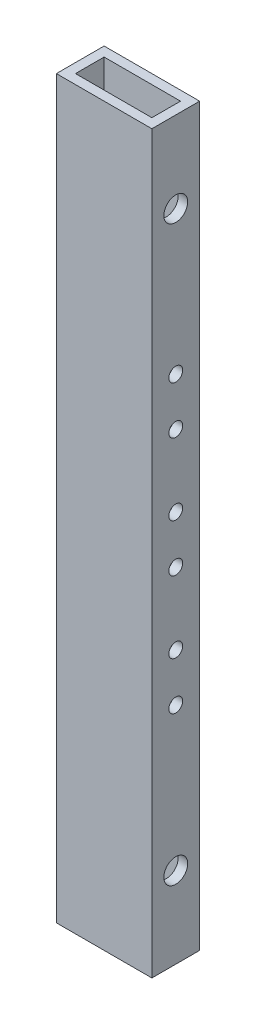
ISO-10303-21;
HEADER;
FILE_DESCRIPTION(('STEP AP214'),'2;1');
FILE_NAME('part.step','',(''),(''),'','','');
FILE_SCHEMA(('AUTOMOTIVE_DESIGN { 1 0 10303 214 1 1 1 1 }'));
ENDSEC;
DATA;
#1=APPLICATION_CONTEXT('core data for automotive mechanical design processes');
#2=APPLICATION_PROTOCOL_DEFINITION('international standard','automotive_design',2000,#1);
#3=PRODUCT_CONTEXT('',#1,'mechanical');
#4=PRODUCT('Part','Part','',(#3));
#5=PRODUCT_RELATED_PRODUCT_CATEGORY('part','',(#4));
#6=PRODUCT_DEFINITION_FORMATION('','',#4);
#7=PRODUCT_DEFINITION_CONTEXT('part definition',#1,'design');
#8=PRODUCT_DEFINITION('design','',#6,#7);
#9=PRODUCT_DEFINITION_SHAPE('','',#8);
#10=(LENGTH_UNIT() NAMED_UNIT(*) SI_UNIT(.MILLI.,.METRE.));
#11=(NAMED_UNIT(*) PLANE_ANGLE_UNIT() SI_UNIT($,.RADIAN.));
#12=(NAMED_UNIT(*) SI_UNIT($,.STERADIAN.) SOLID_ANGLE_UNIT());
#13=UNCERTAINTY_MEASURE_WITH_UNIT(LENGTH_MEASURE(1.E-05),#10,'distance_accuracy_value','');
#14=(GEOMETRIC_REPRESENTATION_CONTEXT(3) GLOBAL_UNCERTAINTY_ASSIGNED_CONTEXT((#13)) GLOBAL_UNIT_ASSIGNED_CONTEXT((#10,
#11,#12)) REPRESENTATION_CONTEXT('',''));
#15=CARTESIAN_POINT('',(0.,0.,0.));
#16=DIRECTION('',(0.,0.,1.));
#17=DIRECTION('',(1.,0.,0.));
#18=AXIS2_PLACEMENT_3D('',#15,#16,#17);
#19=CARTESIAN_POINT('',(0.,77.,0.));
#20=DIRECTION('',(0.,1.,0.));
#21=DIRECTION('',(0.,0.,1.));
#22=AXIS2_PLACEMENT_3D('',#19,#20,#21);
#23=PLANE('',#22);
#24=DIRECTION('',(0.,0.,-1.));
#25=VECTOR('',#24,1.);
#26=CARTESIAN_POINT('',(10.,77.,-5.));
#27=LINE('',#26,#25);
#28=CARTESIAN_POINT('',(10.,77.,5.));
#29=VERTEX_POINT('',#28);
#30=CARTESIAN_POINT('',(10.,77.,-5.));
#31=VERTEX_POINT('',#30);
#32=EDGE_CURVE('E157',#29,#31,#27,.T.);
#33=ORIENTED_EDGE('',*,*,#32,.T.);
#34=DIRECTION('',(-1.,0.,0.));
#35=VECTOR('',#34,1.);
#36=CARTESIAN_POINT('',(-10.,77.,-5.));
#37=LINE('',#36,#35);
#38=CARTESIAN_POINT('',(-10.,77.,-5.));
#39=VERTEX_POINT('',#38);
#40=EDGE_CURVE('E161',#31,#39,#37,.T.);
#41=ORIENTED_EDGE('',*,*,#40,.T.);
#42=DIRECTION('',(0.,0.,1.));
#43=VECTOR('',#42,1.);
#44=CARTESIAN_POINT('',(-10.,77.,-5.));
#45=LINE('',#44,#43);
#46=CARTESIAN_POINT('',(-10.,77.,5.));
#47=VERTEX_POINT('',#46);
#48=EDGE_CURVE('E165',#39,#47,#45,.T.);
#49=ORIENTED_EDGE('',*,*,#48,.T.);
#50=DIRECTION('',(1.,0.,0.));
#51=VECTOR('',#50,1.);
#52=CARTESIAN_POINT('',(-10.,77.,5.));
#53=LINE('',#52,#51);
#54=EDGE_CURVE('E168',#47,#29,#53,.T.);
#55=ORIENTED_EDGE('',*,*,#54,.T.);
#56=EDGE_LOOP('',(#33,#41,#49,#55));
#57=FACE_BOUND('',#56,.T.);
#58=DIRECTION('',(-1.,0.,0.));
#59=VECTOR('',#58,1.);
#60=CARTESIAN_POINT('',(-8.,77.,-3.));
#61=LINE('',#60,#59);
#62=CARTESIAN_POINT('',(8.,77.,-3.));
#63=VERTEX_POINT('',#62);
#64=CARTESIAN_POINT('',(-8.,77.,-3.));
#65=VERTEX_POINT('',#64);
#66=EDGE_CURVE('E116',#63,#65,#61,.T.);
#67=ORIENTED_EDGE('',*,*,#66,.F.);
#68=DIRECTION('',(0.,0.,-1.));
#69=VECTOR('',#68,1.);
#70=CARTESIAN_POINT('',(8.,77.,-3.));
#71=LINE('',#70,#69);
#72=CARTESIAN_POINT('',(8.,77.,3.));
#73=VERTEX_POINT('',#72);
#74=EDGE_CURVE('E107',#73,#63,#71,.T.);
#75=ORIENTED_EDGE('',*,*,#74,.F.);
#76=DIRECTION('',(1.,0.,0.));
#77=VECTOR('',#76,1.);
#78=CARTESIAN_POINT('',(-8.,77.,3.));
#79=LINE('',#78,#77);
#80=CARTESIAN_POINT('',(-8.,77.,3.));
#81=VERTEX_POINT('',#80);
#82=EDGE_CURVE('E133',#81,#73,#79,.T.);
#83=ORIENTED_EDGE('',*,*,#82,.F.);
#84=DIRECTION('',(0.,0.,1.));
#85=VECTOR('',#84,1.);
#86=CARTESIAN_POINT('',(-8.,77.,-3.));
#87=LINE('',#86,#85);
#88=EDGE_CURVE('E129',#65,#81,#87,.T.);
#89=ORIENTED_EDGE('',*,*,#88,.F.);
#90=EDGE_LOOP('',(#67,#75,#83,#89));
#91=FACE_BOUND('',#90,.T.);
#92=ADVANCED_FACE('F39',(#57,#91),#23,.T.);
#93=CARTESIAN_POINT('',(0.,-77.,0.));
#94=DIRECTION('',(0.,1.,0.));
#95=DIRECTION('',(0.,0.,1.));
#96=AXIS2_PLACEMENT_3D('',#93,#94,#95);
#97=PLANE('',#96);
#98=DIRECTION('',(0.,0.,-1.));
#99=VECTOR('',#98,1.);
#100=CARTESIAN_POINT('',(10.,-77.,-5.));
#101=LINE('',#100,#99);
#102=CARTESIAN_POINT('',(10.,-77.,5.));
#103=VERTEX_POINT('',#102);
#104=CARTESIAN_POINT('',(10.,-77.,-5.));
#105=VERTEX_POINT('',#104);
#106=EDGE_CURVE('E125',#103,#105,#101,.T.);
#107=ORIENTED_EDGE('',*,*,#106,.F.);
#108=DIRECTION('',(1.,0.,0.));
#109=VECTOR('',#108,1.);
#110=CARTESIAN_POINT('',(-10.,-77.,5.));
#111=LINE('',#110,#109);
#112=CARTESIAN_POINT('',(-10.,-77.,5.));
#113=VERTEX_POINT('',#112);
#114=EDGE_CURVE('E162',#113,#103,#111,.T.);
#115=ORIENTED_EDGE('',*,*,#114,.F.);
#116=DIRECTION('',(0.,0.,1.));
#117=VECTOR('',#116,1.);
#118=CARTESIAN_POINT('',(-10.,-77.,-5.));
#119=LINE('',#118,#117);
#120=CARTESIAN_POINT('',(-10.,-77.,-5.));
#121=VERTEX_POINT('',#120);
#122=EDGE_CURVE('E178',#121,#113,#119,.T.);
#123=ORIENTED_EDGE('',*,*,#122,.F.);
#124=DIRECTION('',(-1.,0.,0.));
#125=VECTOR('',#124,1.);
#126=CARTESIAN_POINT('',(-10.,-77.,-5.));
#127=LINE('',#126,#125);
#128=EDGE_CURVE('E175',#105,#121,#127,.T.);
#129=ORIENTED_EDGE('',*,*,#128,.F.);
#130=EDGE_LOOP('',(#107,#115,#123,#129));
#131=FACE_BOUND('',#130,.T.);
#132=DIRECTION('',(0.,0.,-1.));
#133=VECTOR('',#132,1.);
#134=CARTESIAN_POINT('',(8.,-77.,-3.));
#135=LINE('',#134,#133);
#136=CARTESIAN_POINT('',(8.,-77.,3.));
#137=VERTEX_POINT('',#136);
#138=CARTESIAN_POINT('',(8.,-77.,-3.));
#139=VERTEX_POINT('',#138);
#140=EDGE_CURVE('E65',#137,#139,#135,.T.);
#141=ORIENTED_EDGE('',*,*,#140,.T.);
#142=DIRECTION('',(-1.,0.,0.));
#143=VECTOR('',#142,1.);
#144=CARTESIAN_POINT('',(-8.,-77.,-3.));
#145=LINE('',#144,#143);
#146=CARTESIAN_POINT('',(-8.,-77.,-3.));
#147=VERTEX_POINT('',#146);
#148=EDGE_CURVE('E123',#139,#147,#145,.T.);
#149=ORIENTED_EDGE('',*,*,#148,.T.);
#150=DIRECTION('',(0.,0.,1.));
#151=VECTOR('',#150,1.);
#152=CARTESIAN_POINT('',(-8.,-77.,-3.));
#153=LINE('',#152,#151);
#154=CARTESIAN_POINT('',(-8.,-77.,3.));
#155=VERTEX_POINT('',#154);
#156=EDGE_CURVE('E144',#147,#155,#153,.T.);
#157=ORIENTED_EDGE('',*,*,#156,.T.);
#158=DIRECTION('',(1.,0.,0.));
#159=VECTOR('',#158,1.);
#160=CARTESIAN_POINT('',(-8.,-77.,3.));
#161=LINE('',#160,#159);
#162=EDGE_CURVE('E117',#155,#137,#161,.T.);
#163=ORIENTED_EDGE('',*,*,#162,.T.);
#164=EDGE_LOOP('',(#141,#149,#157,#163));
#165=FACE_BOUND('',#164,.T.);
#166=ADVANCED_FACE('F270',(#131,#165),#97,.F.);
#167=CARTESIAN_POINT('',(10.,77.,-5.));
#168=DIRECTION('',(-1.,0.,0.));
#169=DIRECTION('',(0.,0.,1.));
#170=AXIS2_PLACEMENT_3D('',#167,#168,#169);
#171=PLANE('',#170);
#172=CARTESIAN_POINT('',(10.,20.,0.));
#173=DIRECTION('',(1.,0.,0.));
#174=DIRECTION('',(0.,0.,-1.));
#175=AXIS2_PLACEMENT_3D('',#172,#173,#174);
#176=CIRCLE('',#175,1.45);
#177=CARTESIAN_POINT('',(10.,20.,-1.45));
#178=VERTEX_POINT('',#177);
#179=EDGE_CURVE('E323',#178,#178,#176,.T.);
#180=ORIENTED_EDGE('',*,*,#179,.F.);
#181=EDGE_LOOP('',(#180));
#182=FACE_BOUND('',#181,.T.);
#183=CARTESIAN_POINT('',(10.,30.,0.));
#184=DIRECTION('',(1.,0.,0.));
#185=DIRECTION('',(0.,0.,-1.));
#186=AXIS2_PLACEMENT_3D('',#183,#184,#185);
#187=CIRCLE('',#186,1.45);
#188=CARTESIAN_POINT('',(10.,30.,-1.45));
#189=VERTEX_POINT('',#188);
#190=EDGE_CURVE('E327',#189,#189,#187,.T.);
#191=ORIENTED_EDGE('',*,*,#190,.F.);
#192=EDGE_LOOP('',(#191));
#193=FACE_BOUND('',#192,.T.);
#194=CARTESIAN_POINT('',(10.,-30.,0.));
#195=DIRECTION('',(1.,0.,0.));
#196=DIRECTION('',(0.,0.,1.));
#197=AXIS2_PLACEMENT_3D('',#194,#195,#196);
#198=CIRCLE('',#197,1.45);
#199=CARTESIAN_POINT('',(10.,-30.,1.45));
#200=VERTEX_POINT('',#199);
#201=EDGE_CURVE('E331',#200,#200,#198,.T.);
#202=ORIENTED_EDGE('',*,*,#201,.F.);
#203=EDGE_LOOP('',(#202));
#204=FACE_BOUND('',#203,.T.);
#205=CARTESIAN_POINT('',(10.,-20.,0.));
#206=DIRECTION('',(1.,0.,0.));
#207=DIRECTION('',(0.,0.,1.));
#208=AXIS2_PLACEMENT_3D('',#205,#206,#207);
#209=CIRCLE('',#208,1.45);
#210=CARTESIAN_POINT('',(10.,-20.,1.45));
#211=VERTEX_POINT('',#210);
#212=EDGE_CURVE('E335',#211,#211,#209,.T.);
#213=ORIENTED_EDGE('',*,*,#212,.F.);
#214=EDGE_LOOP('',(#213));
#215=FACE_BOUND('',#214,.T.);
#216=CARTESIAN_POINT('',(10.,-5.,0.));
#217=DIRECTION('',(1.,0.,0.));
#218=DIRECTION('',(0.,0.,1.));
#219=AXIS2_PLACEMENT_3D('',#216,#217,#218);
#220=CIRCLE('',#219,1.45);
#221=CARTESIAN_POINT('',(10.,-5.,1.45));
#222=VERTEX_POINT('',#221);
#223=EDGE_CURVE('E339',#222,#222,#220,.T.);
#224=ORIENTED_EDGE('',*,*,#223,.F.);
#225=EDGE_LOOP('',(#224));
#226=FACE_BOUND('',#225,.T.);
#227=CARTESIAN_POINT('',(10.,60.,0.));
#228=DIRECTION('',(1.,0.,0.));
#229=DIRECTION('',(0.,0.,-1.));
#230=AXIS2_PLACEMENT_3D('',#227,#228,#229);
#231=CIRCLE('',#230,2.5);
#232=CARTESIAN_POINT('',(10.,60.,-2.49999999999999));
#233=VERTEX_POINT('',#232);
#234=EDGE_CURVE('E343',#233,#233,#231,.T.);
#235=ORIENTED_EDGE('',*,*,#234,.F.);
#236=EDGE_LOOP('',(#235));
#237=FACE_BOUND('',#236,.T.);
#238=CARTESIAN_POINT('',(10.,-60.,0.));
#239=DIRECTION('',(1.,0.,0.));
#240=DIRECTION('',(0.,0.,1.));
#241=AXIS2_PLACEMENT_3D('',#238,#239,#240);
#242=CIRCLE('',#241,2.5);
#243=CARTESIAN_POINT('',(10.,-60.,2.5));
#244=VERTEX_POINT('',#243);
#245=EDGE_CURVE('E347',#244,#244,#242,.T.);
#246=ORIENTED_EDGE('',*,*,#245,.F.);
#247=EDGE_LOOP('',(#246));
#248=FACE_BOUND('',#247,.T.);
#249=CARTESIAN_POINT('',(10.,5.,0.));
#250=DIRECTION('',(1.,0.,0.));
#251=DIRECTION('',(0.,0.,-1.));
#252=AXIS2_PLACEMENT_3D('',#249,#250,#251);
#253=CIRCLE('',#252,1.45);
#254=CARTESIAN_POINT('',(10.,5.,-1.45));
#255=VERTEX_POINT('',#254);
#256=EDGE_CURVE('E350',#255,#255,#253,.T.);
#257=ORIENTED_EDGE('',*,*,#256,.F.);
#258=EDGE_LOOP('',(#257));
#259=FACE_BOUND('',#258,.T.);
#260=ORIENTED_EDGE('',*,*,#106,.T.);
#261=DIRECTION('',(0.,-1.,0.));
#262=VECTOR('',#261,1.);
#263=CARTESIAN_POINT('',(10.,77.,-5.));
#264=LINE('',#263,#262);
#265=EDGE_CURVE('E11',#31,#105,#264,.T.);
#266=ORIENTED_EDGE('',*,*,#265,.F.);
#267=ORIENTED_EDGE('',*,*,#32,.F.);
#268=DIRECTION('',(0.,-1.,0.));
#269=VECTOR('',#268,1.);
#270=CARTESIAN_POINT('',(10.,77.,5.));
#271=LINE('',#270,#269);
#272=EDGE_CURVE('E171',#29,#103,#271,.T.);
#273=ORIENTED_EDGE('',*,*,#272,.T.);
#274=EDGE_LOOP('',(#260,#266,#267,#273));
#275=FACE_BOUND('',#274,.T.);
#276=ADVANCED_FACE('F41',(#182,#193,#204,#215,#226,#237,#248,#259,#275),#171,.F.);
#277=CARTESIAN_POINT('',(-10.,77.,-5.));
#278=DIRECTION('',(0.,0.,1.));
#279=DIRECTION('',(1.,0.,0.));
#280=AXIS2_PLACEMENT_3D('',#277,#278,#279);
#281=PLANE('',#280);
#282=ORIENTED_EDGE('',*,*,#128,.T.);
#283=DIRECTION('',(0.,-1.,0.));
#284=VECTOR('',#283,1.);
#285=CARTESIAN_POINT('',(-10.,77.,-5.));
#286=LINE('',#285,#284);
#287=EDGE_CURVE('E49',#39,#121,#286,.T.);
#288=ORIENTED_EDGE('',*,*,#287,.F.);
#289=ORIENTED_EDGE('',*,*,#40,.F.);
#290=ORIENTED_EDGE('',*,*,#265,.T.);
#291=EDGE_LOOP('',(#282,#288,#289,#290));
#292=FACE_BOUND('',#291,.T.);
#293=ADVANCED_FACE('F298',(#292),#281,.F.);
#294=CARTESIAN_POINT('',(-10.,77.,-5.));
#295=DIRECTION('',(1.,0.,0.));
#296=DIRECTION('',(0.,0.,-1.));
#297=AXIS2_PLACEMENT_3D('',#294,#295,#296);
#298=PLANE('',#297);
#299=CARTESIAN_POINT('',(-10.,20.,0.));
#300=DIRECTION('',(1.,0.,0.));
#301=DIRECTION('',(0.,0.,-1.));
#302=AXIS2_PLACEMENT_3D('',#299,#300,#301);
#303=CIRCLE('',#302,1.45);
#304=CARTESIAN_POINT('',(-10.,20.,-1.45));
#305=VERTEX_POINT('',#304);
#306=EDGE_CURVE('E353',#305,#305,#303,.T.);
#307=ORIENTED_EDGE('',*,*,#306,.T.);
#308=EDGE_LOOP('',(#307));
#309=FACE_BOUND('',#308,.T.);
#310=CARTESIAN_POINT('',(-10.,30.,0.));
#311=DIRECTION('',(1.,0.,0.));
#312=DIRECTION('',(0.,0.,-1.));
#313=AXIS2_PLACEMENT_3D('',#310,#311,#312);
#314=CIRCLE('',#313,1.45);
#315=CARTESIAN_POINT('',(-10.,30.,-1.45));
#316=VERTEX_POINT('',#315);
#317=EDGE_CURVE('E451',#316,#316,#314,.T.);
#318=ORIENTED_EDGE('',*,*,#317,.T.);
#319=EDGE_LOOP('',(#318));
#320=FACE_BOUND('',#319,.T.);
#321=CARTESIAN_POINT('',(-10.,-30.,0.));
#322=DIRECTION('',(1.,0.,0.));
#323=DIRECTION('',(0.,0.,1.));
#324=AXIS2_PLACEMENT_3D('',#321,#322,#323);
#325=CIRCLE('',#324,1.45);
#326=CARTESIAN_POINT('',(-10.,-30.,1.45));
#327=VERTEX_POINT('',#326);
#328=EDGE_CURVE('E457',#327,#327,#325,.T.);
#329=ORIENTED_EDGE('',*,*,#328,.T.);
#330=EDGE_LOOP('',(#329));
#331=FACE_BOUND('',#330,.T.);
#332=CARTESIAN_POINT('',(-10.,-20.,0.));
#333=DIRECTION('',(1.,0.,0.));
#334=DIRECTION('',(0.,0.,1.));
#335=AXIS2_PLACEMENT_3D('',#332,#333,#334);
#336=CIRCLE('',#335,1.45);
#337=CARTESIAN_POINT('',(-10.,-20.,1.45));
#338=VERTEX_POINT('',#337);
#339=EDGE_CURVE('E463',#338,#338,#336,.T.);
#340=ORIENTED_EDGE('',*,*,#339,.T.);
#341=EDGE_LOOP('',(#340));
#342=FACE_BOUND('',#341,.T.);
#343=CARTESIAN_POINT('',(-10.,-5.,0.));
#344=DIRECTION('',(1.,0.,0.));
#345=DIRECTION('',(0.,0.,1.));
#346=AXIS2_PLACEMENT_3D('',#343,#344,#345);
#347=CIRCLE('',#346,1.45);
#348=CARTESIAN_POINT('',(-10.,-5.,1.45));
#349=VERTEX_POINT('',#348);
#350=EDGE_CURVE('E467',#349,#349,#347,.T.);
#351=ORIENTED_EDGE('',*,*,#350,.T.);
#352=EDGE_LOOP('',(#351));
#353=FACE_BOUND('',#352,.T.);
#354=CARTESIAN_POINT('',(-10.,60.,0.));
#355=DIRECTION('',(1.,0.,0.));
#356=DIRECTION('',(0.,0.,-1.));
#357=AXIS2_PLACEMENT_3D('',#354,#355,#356);
#358=CIRCLE('',#357,2.5);
#359=CARTESIAN_POINT('',(-10.,60.,-2.49999999999999));
#360=VERTEX_POINT('',#359);
#361=EDGE_CURVE('E436',#360,#360,#358,.T.);
#362=ORIENTED_EDGE('',*,*,#361,.T.);
#363=EDGE_LOOP('',(#362));
#364=FACE_BOUND('',#363,.T.);
#365=CARTESIAN_POINT('',(-10.,-60.,0.));
#366=DIRECTION('',(1.,0.,0.));
#367=DIRECTION('',(0.,0.,1.));
#368=AXIS2_PLACEMENT_3D('',#365,#366,#367);
#369=CIRCLE('',#368,2.5);
#370=CARTESIAN_POINT('',(-10.,-60.,2.5));
#371=VERTEX_POINT('',#370);
#372=EDGE_CURVE('E437',#371,#371,#369,.T.);
#373=ORIENTED_EDGE('',*,*,#372,.T.);
#374=EDGE_LOOP('',(#373));
#375=FACE_BOUND('',#374,.T.);
#376=CARTESIAN_POINT('',(-10.,5.,0.));
#377=DIRECTION('',(1.,0.,0.));
#378=DIRECTION('',(0.,0.,-1.));
#379=AXIS2_PLACEMENT_3D('',#376,#377,#378);
#380=CIRCLE('',#379,1.45);
#381=CARTESIAN_POINT('',(-10.,5.,-1.45));
#382=VERTEX_POINT('',#381);
#383=EDGE_CURVE('E198',#382,#382,#380,.T.);
#384=ORIENTED_EDGE('',*,*,#383,.T.);
#385=EDGE_LOOP('',(#384));
#386=FACE_BOUND('',#385,.T.);
#387=ORIENTED_EDGE('',*,*,#122,.T.);
#388=DIRECTION('',(0.,-1.,0.));
#389=VECTOR('',#388,1.);
#390=CARTESIAN_POINT('',(-10.,77.,5.));
#391=LINE('',#390,#389);
#392=EDGE_CURVE('E186',#47,#113,#391,.T.);
#393=ORIENTED_EDGE('',*,*,#392,.F.);
#394=ORIENTED_EDGE('',*,*,#48,.F.);
#395=ORIENTED_EDGE('',*,*,#287,.T.);
#396=EDGE_LOOP('',(#387,#393,#394,#395));
#397=FACE_BOUND('',#396,.T.);
#398=ADVANCED_FACE('F295',(#309,#320,#331,#342,#353,#364,#375,#386,#397),#298,.F.);
#399=CARTESIAN_POINT('',(-10.,77.,5.));
#400=DIRECTION('',(0.,0.,-1.));
#401=DIRECTION('',(-1.,0.,0.));
#402=AXIS2_PLACEMENT_3D('',#399,#400,#401);
#403=PLANE('',#402);
#404=ORIENTED_EDGE('',*,*,#114,.T.);
#405=ORIENTED_EDGE('',*,*,#272,.F.);
#406=ORIENTED_EDGE('',*,*,#54,.F.);
#407=ORIENTED_EDGE('',*,*,#392,.T.);
#408=EDGE_LOOP('',(#404,#405,#406,#407));
#409=FACE_BOUND('',#408,.T.);
#410=ADVANCED_FACE('F292',(#409),#403,.F.);
#411=CARTESIAN_POINT('',(8.,77.,-3.));
#412=DIRECTION('',(-1.,0.,0.));
#413=DIRECTION('',(0.,0.,1.));
#414=AXIS2_PLACEMENT_3D('',#411,#412,#413);
#415=PLANE('',#414);
#416=CARTESIAN_POINT('',(8.,20.,0.));
#417=DIRECTION('',(-1.,0.,0.));
#418=DIRECTION('',(0.,0.,1.));
#419=AXIS2_PLACEMENT_3D('',#416,#417,#418);
#420=CIRCLE('',#419,1.45);
#421=CARTESIAN_POINT('',(8.,20.,1.45));
#422=VERTEX_POINT('',#421);
#423=EDGE_CURVE('E141',#422,#422,#420,.T.);
#424=ORIENTED_EDGE('',*,*,#423,.F.);
#425=EDGE_LOOP('',(#424));
#426=FACE_BOUND('',#425,.T.);
#427=CARTESIAN_POINT('',(8.,30.,0.));
#428=DIRECTION('',(-1.,0.,0.));
#429=DIRECTION('',(0.,0.,1.));
#430=AXIS2_PLACEMENT_3D('',#427,#428,#429);
#431=CIRCLE('',#430,1.45);
#432=CARTESIAN_POINT('',(8.,30.,1.45));
#433=VERTEX_POINT('',#432);
#434=EDGE_CURVE('E226',#433,#433,#431,.T.);
#435=ORIENTED_EDGE('',*,*,#434,.F.);
#436=EDGE_LOOP('',(#435));
#437=FACE_BOUND('',#436,.T.);
#438=CARTESIAN_POINT('',(8.,-30.,0.));
#439=DIRECTION('',(-1.,0.,0.));
#440=DIRECTION('',(0.,0.,1.));
#441=AXIS2_PLACEMENT_3D('',#438,#439,#440);
#442=CIRCLE('',#441,1.45);
#443=CARTESIAN_POINT('',(8.,-30.,1.45));
#444=VERTEX_POINT('',#443);
#445=EDGE_CURVE('E222',#444,#444,#442,.T.);
#446=ORIENTED_EDGE('',*,*,#445,.F.);
#447=EDGE_LOOP('',(#446));
#448=FACE_BOUND('',#447,.T.);
#449=CARTESIAN_POINT('',(8.,-20.,0.));
#450=DIRECTION('',(-1.,0.,0.));
#451=DIRECTION('',(0.,0.,1.));
#452=AXIS2_PLACEMENT_3D('',#449,#450,#451);
#453=CIRCLE('',#452,1.45);
#454=CARTESIAN_POINT('',(8.,-20.,1.45));
#455=VERTEX_POINT('',#454);
#456=EDGE_CURVE('E218',#455,#455,#453,.T.);
#457=ORIENTED_EDGE('',*,*,#456,.F.);
#458=EDGE_LOOP('',(#457));
#459=FACE_BOUND('',#458,.T.);
#460=CARTESIAN_POINT('',(8.,-5.,0.));
#461=DIRECTION('',(-1.,0.,0.));
#462=DIRECTION('',(0.,0.,1.));
#463=AXIS2_PLACEMENT_3D('',#460,#461,#462);
#464=CIRCLE('',#463,1.45);
#465=CARTESIAN_POINT('',(8.,-5.,1.45));
#466=VERTEX_POINT('',#465);
#467=EDGE_CURVE('E213',#466,#466,#464,.T.);
#468=ORIENTED_EDGE('',*,*,#467,.F.);
#469=EDGE_LOOP('',(#468));
#470=FACE_BOUND('',#469,.T.);
#471=CARTESIAN_POINT('',(8.,60.,0.));
#472=DIRECTION('',(-1.,0.,0.));
#473=DIRECTION('',(0.,0.,1.));
#474=AXIS2_PLACEMENT_3D('',#471,#472,#473);
#475=CIRCLE('',#474,2.5);
#476=CARTESIAN_POINT('',(8.,60.,2.50000000000001));
#477=VERTEX_POINT('',#476);
#478=EDGE_CURVE('E208',#477,#477,#475,.T.);
#479=ORIENTED_EDGE('',*,*,#478,.F.);
#480=EDGE_LOOP('',(#479));
#481=FACE_BOUND('',#480,.T.);
#482=CARTESIAN_POINT('',(8.,-60.,0.));
#483=DIRECTION('',(-1.,0.,0.));
#484=DIRECTION('',(0.,0.,1.));
#485=AXIS2_PLACEMENT_3D('',#482,#483,#484);
#486=CIRCLE('',#485,2.5);
#487=CARTESIAN_POINT('',(8.,-60.,2.5));
#488=VERTEX_POINT('',#487);
#489=EDGE_CURVE('E203',#488,#488,#486,.T.);
#490=ORIENTED_EDGE('',*,*,#489,.F.);
#491=EDGE_LOOP('',(#490));
#492=FACE_BOUND('',#491,.T.);
#493=CARTESIAN_POINT('',(8.,5.,0.));
#494=DIRECTION('',(-1.,0.,0.));
#495=DIRECTION('',(0.,0.,1.));
#496=AXIS2_PLACEMENT_3D('',#493,#494,#495);
#497=CIRCLE('',#496,1.45);
#498=CARTESIAN_POINT('',(8.,5.,1.45));
#499=VERTEX_POINT('',#498);
#500=EDGE_CURVE('E197',#499,#499,#497,.T.);
#501=ORIENTED_EDGE('',*,*,#500,.F.);
#502=EDGE_LOOP('',(#501));
#503=FACE_BOUND('',#502,.T.);
#504=ORIENTED_EDGE('',*,*,#140,.F.);
#505=DIRECTION('',(0.,-1.,0.));
#506=VECTOR('',#505,1.);
#507=CARTESIAN_POINT('',(8.,77.,3.));
#508=LINE('',#507,#506);
#509=EDGE_CURVE('E111',#73,#137,#508,.T.);
#510=ORIENTED_EDGE('',*,*,#509,.F.);
#511=ORIENTED_EDGE('',*,*,#74,.T.);
#512=DIRECTION('',(0.,-1.,0.));
#513=VECTOR('',#512,1.);
#514=CARTESIAN_POINT('',(8.,77.,-3.));
#515=LINE('',#514,#513);
#516=EDGE_CURVE('E110',#63,#139,#515,.T.);
#517=ORIENTED_EDGE('',*,*,#516,.T.);
#518=EDGE_LOOP('',(#504,#510,#511,#517));
#519=FACE_BOUND('',#518,.T.);
#520=ADVANCED_FACE('F109',(#426,#437,#448,#459,#470,#481,#492,#503,#519),#415,.T.);
#521=CARTESIAN_POINT('',(-8.,77.,-3.));
#522=DIRECTION('',(0.,0.,1.));
#523=DIRECTION('',(1.,0.,0.));
#524=AXIS2_PLACEMENT_3D('',#521,#522,#523);
#525=PLANE('',#524);
#526=ORIENTED_EDGE('',*,*,#148,.F.);
#527=ORIENTED_EDGE('',*,*,#516,.F.);
#528=ORIENTED_EDGE('',*,*,#66,.T.);
#529=DIRECTION('',(0.,-1.,0.));
#530=VECTOR('',#529,1.);
#531=CARTESIAN_POINT('',(-8.,77.,-3.));
#532=LINE('',#531,#530);
#533=EDGE_CURVE('E126',#65,#147,#532,.T.);
#534=ORIENTED_EDGE('',*,*,#533,.T.);
#535=EDGE_LOOP('',(#526,#527,#528,#534));
#536=FACE_BOUND('',#535,.T.);
#537=ADVANCED_FACE('F120',(#536),#525,.T.);
#538=CARTESIAN_POINT('',(-8.,77.,-3.));
#539=DIRECTION('',(1.,0.,0.));
#540=DIRECTION('',(0.,0.,-1.));
#541=AXIS2_PLACEMENT_3D('',#538,#539,#540);
#542=PLANE('',#541);
#543=CARTESIAN_POINT('',(-8.,20.,0.));
#544=DIRECTION('',(1.,0.,0.));
#545=DIRECTION('',(0.,0.,-1.));
#546=AXIS2_PLACEMENT_3D('',#543,#544,#545);
#547=CIRCLE('',#546,1.45);
#548=CARTESIAN_POINT('',(-8.,20.,-1.45));
#549=VERTEX_POINT('',#548);
#550=EDGE_CURVE('E43',#549,#549,#547,.T.);
#551=ORIENTED_EDGE('',*,*,#550,.F.);
#552=EDGE_LOOP('',(#551));
#553=FACE_BOUND('',#552,.T.);
#554=CARTESIAN_POINT('',(-8.,30.,0.));
#555=DIRECTION('',(1.,0.,0.));
#556=DIRECTION('',(0.,0.,-1.));
#557=AXIS2_PLACEMENT_3D('',#554,#555,#556);
#558=CIRCLE('',#557,1.45);
#559=CARTESIAN_POINT('',(-8.,30.,-1.45));
#560=VERTEX_POINT('',#559);
#561=EDGE_CURVE('E223',#560,#560,#558,.T.);
#562=ORIENTED_EDGE('',*,*,#561,.F.);
#563=EDGE_LOOP('',(#562));
#564=FACE_BOUND('',#563,.T.);
#565=CARTESIAN_POINT('',(-8.,-30.,0.));
#566=DIRECTION('',(1.,0.,0.));
#567=DIRECTION('',(0.,0.,-1.));
#568=AXIS2_PLACEMENT_3D('',#565,#566,#567);
#569=CIRCLE('',#568,1.45);
#570=CARTESIAN_POINT('',(-8.,-30.,-1.45));
#571=VERTEX_POINT('',#570);
#572=EDGE_CURVE('E219',#571,#571,#569,.T.);
#573=ORIENTED_EDGE('',*,*,#572,.F.);
#574=EDGE_LOOP('',(#573));
#575=FACE_BOUND('',#574,.T.);
#576=CARTESIAN_POINT('',(-8.,-20.,0.));
#577=DIRECTION('',(1.,0.,0.));
#578=DIRECTION('',(0.,0.,-1.));
#579=AXIS2_PLACEMENT_3D('',#576,#577,#578);
#580=CIRCLE('',#579,1.45);
#581=CARTESIAN_POINT('',(-8.,-20.,-1.45));
#582=VERTEX_POINT('',#581);
#583=EDGE_CURVE('E214',#582,#582,#580,.T.);
#584=ORIENTED_EDGE('',*,*,#583,.F.);
#585=EDGE_LOOP('',(#584));
#586=FACE_BOUND('',#585,.T.);
#587=CARTESIAN_POINT('',(-8.,-5.,0.));
#588=DIRECTION('',(1.,0.,0.));
#589=DIRECTION('',(0.,0.,-1.));
#590=AXIS2_PLACEMENT_3D('',#587,#588,#589);
#591=CIRCLE('',#590,1.45);
#592=CARTESIAN_POINT('',(-8.,-5.,-1.45));
#593=VERTEX_POINT('',#592);
#594=EDGE_CURVE('E209',#593,#593,#591,.T.);
#595=ORIENTED_EDGE('',*,*,#594,.F.);
#596=EDGE_LOOP('',(#595));
#597=FACE_BOUND('',#596,.T.);
#598=CARTESIAN_POINT('',(-8.,60.,0.));
#599=DIRECTION('',(1.,0.,0.));
#600=DIRECTION('',(0.,0.,-1.));
#601=AXIS2_PLACEMENT_3D('',#598,#599,#600);
#602=CIRCLE('',#601,2.5);
#603=CARTESIAN_POINT('',(-8.,60.,-2.49999999999999));
#604=VERTEX_POINT('',#603);
#605=EDGE_CURVE('E204',#604,#604,#602,.T.);
#606=ORIENTED_EDGE('',*,*,#605,.F.);
#607=EDGE_LOOP('',(#606));
#608=FACE_BOUND('',#607,.T.);
#609=CARTESIAN_POINT('',(-8.,-60.,0.));
#610=DIRECTION('',(1.,0.,0.));
#611=DIRECTION('',(0.,0.,-1.));
#612=AXIS2_PLACEMENT_3D('',#609,#610,#611);
#613=CIRCLE('',#612,2.5);
#614=CARTESIAN_POINT('',(-8.,-60.,-2.50000000000001));
#615=VERTEX_POINT('',#614);
#616=EDGE_CURVE('E199',#615,#615,#613,.T.);
#617=ORIENTED_EDGE('',*,*,#616,.F.);
#618=EDGE_LOOP('',(#617));
#619=FACE_BOUND('',#618,.T.);
#620=CARTESIAN_POINT('',(-8.,5.,0.));
#621=DIRECTION('',(1.,0.,0.));
#622=DIRECTION('',(0.,0.,-1.));
#623=AXIS2_PLACEMENT_3D('',#620,#621,#622);
#624=CIRCLE('',#623,1.45);
#625=CARTESIAN_POINT('',(-8.,5.,-1.45));
#626=VERTEX_POINT('',#625);
#627=EDGE_CURVE('E193',#626,#626,#624,.T.);
#628=ORIENTED_EDGE('',*,*,#627,.F.);
#629=EDGE_LOOP('',(#628));
#630=FACE_BOUND('',#629,.T.);
#631=ORIENTED_EDGE('',*,*,#156,.F.);
#632=ORIENTED_EDGE('',*,*,#533,.F.);
#633=ORIENTED_EDGE('',*,*,#88,.T.);
#634=DIRECTION('',(0.,-1.,0.));
#635=VECTOR('',#634,1.);
#636=CARTESIAN_POINT('',(-8.,77.,3.));
#637=LINE('',#636,#635);
#638=EDGE_CURVE('E57',#81,#155,#637,.T.);
#639=ORIENTED_EDGE('',*,*,#638,.T.);
#640=EDGE_LOOP('',(#631,#632,#633,#639));
#641=FACE_BOUND('',#640,.T.);
#642=ADVANCED_FACE('F250',(#553,#564,#575,#586,#597,#608,#619,#630,#641),#542,.T.);
#643=CARTESIAN_POINT('',(-8.,77.,3.));
#644=DIRECTION('',(0.,0.,-1.));
#645=DIRECTION('',(-1.,0.,0.));
#646=AXIS2_PLACEMENT_3D('',#643,#644,#645);
#647=PLANE('',#646);
#648=ORIENTED_EDGE('',*,*,#162,.F.);
#649=ORIENTED_EDGE('',*,*,#638,.F.);
#650=ORIENTED_EDGE('',*,*,#82,.T.);
#651=ORIENTED_EDGE('',*,*,#509,.T.);
#652=EDGE_LOOP('',(#648,#649,#650,#651));
#653=FACE_BOUND('',#652,.T.);
#654=ADVANCED_FACE('F253',(#653),#647,.T.);
#655=CARTESIAN_POINT('',(-10.,5.,0.));
#656=DIRECTION('',(1.,0.,0.));
#657=DIRECTION('',(0.,0.,-1.));
#658=AXIS2_PLACEMENT_3D('',#655,#656,#657);
#659=CYLINDRICAL_SURFACE('',#658,1.45);
#660=ORIENTED_EDGE('',*,*,#627,.T.);
#661=EDGE_LOOP('',(#660));
#662=FACE_BOUND('',#661,.T.);
#663=ORIENTED_EDGE('',*,*,#383,.F.);
#664=EDGE_LOOP('',(#663));
#665=FACE_BOUND('',#664,.T.);
#666=ADVANCED_FACE('F272',(#662,#665),#659,.F.);
#667=CARTESIAN_POINT('',(-10.,-60.,0.));
#668=DIRECTION('',(1.,0.,0.));
#669=DIRECTION('',(0.,0.,-1.));
#670=AXIS2_PLACEMENT_3D('',#667,#668,#669);
#671=CYLINDRICAL_SURFACE('',#670,2.5);
#672=ORIENTED_EDGE('',*,*,#616,.T.);
#673=EDGE_LOOP('',(#672));
#674=FACE_BOUND('',#673,.T.);
#675=ORIENTED_EDGE('',*,*,#372,.F.);
#676=EDGE_LOOP('',(#675));
#677=FACE_BOUND('',#676,.T.);
#678=ADVANCED_FACE('F277',(#674,#677),#671,.F.);
#679=CARTESIAN_POINT('',(-10.,60.,0.));
#680=DIRECTION('',(1.,0.,0.));
#681=DIRECTION('',(0.,0.,-1.));
#682=AXIS2_PLACEMENT_3D('',#679,#680,#681);
#683=CYLINDRICAL_SURFACE('',#682,2.5);
#684=ORIENTED_EDGE('',*,*,#605,.T.);
#685=EDGE_LOOP('',(#684));
#686=FACE_BOUND('',#685,.T.);
#687=ORIENTED_EDGE('',*,*,#361,.F.);
#688=EDGE_LOOP('',(#687));
#689=FACE_BOUND('',#688,.T.);
#690=ADVANCED_FACE('F415',(#686,#689),#683,.F.);
#691=CARTESIAN_POINT('',(-10.,-5.,0.));
#692=DIRECTION('',(1.,0.,0.));
#693=DIRECTION('',(0.,0.,-1.));
#694=AXIS2_PLACEMENT_3D('',#691,#692,#693);
#695=CYLINDRICAL_SURFACE('',#694,1.45);
#696=ORIENTED_EDGE('',*,*,#594,.T.);
#697=EDGE_LOOP('',(#696));
#698=FACE_BOUND('',#697,.T.);
#699=ORIENTED_EDGE('',*,*,#350,.F.);
#700=EDGE_LOOP('',(#699));
#701=FACE_BOUND('',#700,.T.);
#702=ADVANCED_FACE('F404',(#698,#701),#695,.F.);
#703=CARTESIAN_POINT('',(-10.,-20.,0.));
#704=DIRECTION('',(1.,0.,0.));
#705=DIRECTION('',(0.,0.,-1.));
#706=AXIS2_PLACEMENT_3D('',#703,#704,#705);
#707=CYLINDRICAL_SURFACE('',#706,1.45);
#708=ORIENTED_EDGE('',*,*,#583,.T.);
#709=EDGE_LOOP('',(#708));
#710=FACE_BOUND('',#709,.T.);
#711=ORIENTED_EDGE('',*,*,#339,.F.);
#712=EDGE_LOOP('',(#711));
#713=FACE_BOUND('',#712,.T.);
#714=ADVANCED_FACE('F400',(#710,#713),#707,.F.);
#715=CARTESIAN_POINT('',(-10.,-30.,0.));
#716=DIRECTION('',(1.,0.,0.));
#717=DIRECTION('',(0.,0.,-1.));
#718=AXIS2_PLACEMENT_3D('',#715,#716,#717);
#719=CYLINDRICAL_SURFACE('',#718,1.45);
#720=ORIENTED_EDGE('',*,*,#572,.T.);
#721=EDGE_LOOP('',(#720));
#722=FACE_BOUND('',#721,.T.);
#723=ORIENTED_EDGE('',*,*,#328,.F.);
#724=EDGE_LOOP('',(#723));
#725=FACE_BOUND('',#724,.T.);
#726=ADVANCED_FACE('F403',(#722,#725),#719,.F.);
#727=CARTESIAN_POINT('',(-10.,30.,0.));
#728=DIRECTION('',(1.,0.,0.));
#729=DIRECTION('',(0.,0.,-1.));
#730=AXIS2_PLACEMENT_3D('',#727,#728,#729);
#731=CYLINDRICAL_SURFACE('',#730,1.45);
#732=ORIENTED_EDGE('',*,*,#561,.T.);
#733=EDGE_LOOP('',(#732));
#734=FACE_BOUND('',#733,.T.);
#735=ORIENTED_EDGE('',*,*,#317,.F.);
#736=EDGE_LOOP('',(#735));
#737=FACE_BOUND('',#736,.T.);
#738=ADVANCED_FACE('F396',(#734,#737),#731,.F.);
#739=CARTESIAN_POINT('',(-10.,20.,0.));
#740=DIRECTION('',(1.,0.,0.));
#741=DIRECTION('',(0.,0.,-1.));
#742=AXIS2_PLACEMENT_3D('',#739,#740,#741);
#743=CYLINDRICAL_SURFACE('',#742,1.45);
#744=ORIENTED_EDGE('',*,*,#550,.T.);
#745=EDGE_LOOP('',(#744));
#746=FACE_BOUND('',#745,.T.);
#747=ORIENTED_EDGE('',*,*,#306,.F.);
#748=EDGE_LOOP('',(#747));
#749=FACE_BOUND('',#748,.T.);
#750=ADVANCED_FACE('F247',(#746,#749),#743,.F.);
#751=ORIENTED_EDGE('',*,*,#500,.T.);
#752=EDGE_LOOP('',(#751));
#753=FACE_BOUND('',#752,.T.);
#754=ORIENTED_EDGE('',*,*,#256,.T.);
#755=EDGE_LOOP('',(#754));
#756=FACE_BOUND('',#755,.T.);
#757=ADVANCED_FACE('F280',(#753,#756),#659,.F.);
#758=ORIENTED_EDGE('',*,*,#489,.T.);
#759=EDGE_LOOP('',(#758));
#760=FACE_BOUND('',#759,.T.);
#761=ORIENTED_EDGE('',*,*,#245,.T.);
#762=EDGE_LOOP('',(#761));
#763=FACE_BOUND('',#762,.T.);
#764=ADVANCED_FACE('F388',(#760,#763),#671,.F.);
#765=ORIENTED_EDGE('',*,*,#478,.T.);
#766=EDGE_LOOP('',(#765));
#767=FACE_BOUND('',#766,.T.);
#768=ORIENTED_EDGE('',*,*,#234,.T.);
#769=EDGE_LOOP('',(#768));
#770=FACE_BOUND('',#769,.T.);
#771=ADVANCED_FACE('F393',(#767,#770),#683,.F.);
#772=ORIENTED_EDGE('',*,*,#467,.T.);
#773=EDGE_LOOP('',(#772));
#774=FACE_BOUND('',#773,.T.);
#775=ORIENTED_EDGE('',*,*,#223,.T.);
#776=EDGE_LOOP('',(#775));
#777=FACE_BOUND('',#776,.T.);
#778=ADVANCED_FACE('F375',(#774,#777),#695,.F.);
#779=ORIENTED_EDGE('',*,*,#456,.T.);
#780=EDGE_LOOP('',(#779));
#781=FACE_BOUND('',#780,.T.);
#782=ORIENTED_EDGE('',*,*,#212,.T.);
#783=EDGE_LOOP('',(#782));
#784=FACE_BOUND('',#783,.T.);
#785=ADVANCED_FACE('F406',(#781,#784),#707,.F.);
#786=ORIENTED_EDGE('',*,*,#445,.T.);
#787=EDGE_LOOP('',(#786));
#788=FACE_BOUND('',#787,.T.);
#789=ORIENTED_EDGE('',*,*,#201,.T.);
#790=EDGE_LOOP('',(#789));
#791=FACE_BOUND('',#790,.T.);
#792=ADVANCED_FACE('F410',(#788,#791),#719,.F.);
#793=ORIENTED_EDGE('',*,*,#434,.T.);
#794=EDGE_LOOP('',(#793));
#795=FACE_BOUND('',#794,.T.);
#796=ORIENTED_EDGE('',*,*,#190,.T.);
#797=EDGE_LOOP('',(#796));
#798=FACE_BOUND('',#797,.T.);
#799=ADVANCED_FACE('F412',(#795,#798),#731,.F.);
#800=ORIENTED_EDGE('',*,*,#423,.T.);
#801=EDGE_LOOP('',(#800));
#802=FACE_BOUND('',#801,.T.);
#803=ORIENTED_EDGE('',*,*,#179,.T.);
#804=EDGE_LOOP('',(#803));
#805=FACE_BOUND('',#804,.T.);
#806=ADVANCED_FACE('F398',(#802,#805),#743,.F.);
#807=CLOSED_SHELL('',(#92,#166,#276,#293,#398,#410,#520,#537,#642,#654,#666,#678,#690,#702,#714,
#726,#738,#750,#757,#764,#771,#778,#785,#792,#799,#806));
#808=MANIFOLD_SOLID_BREP('B2',#807);
#809=ADVANCED_BREP_SHAPE_REPRESENTATION('',(#18,#808),#14);
#810=SHAPE_DEFINITION_REPRESENTATION(#9,#809);
ENDSEC;
END-ISO-10303-21;
